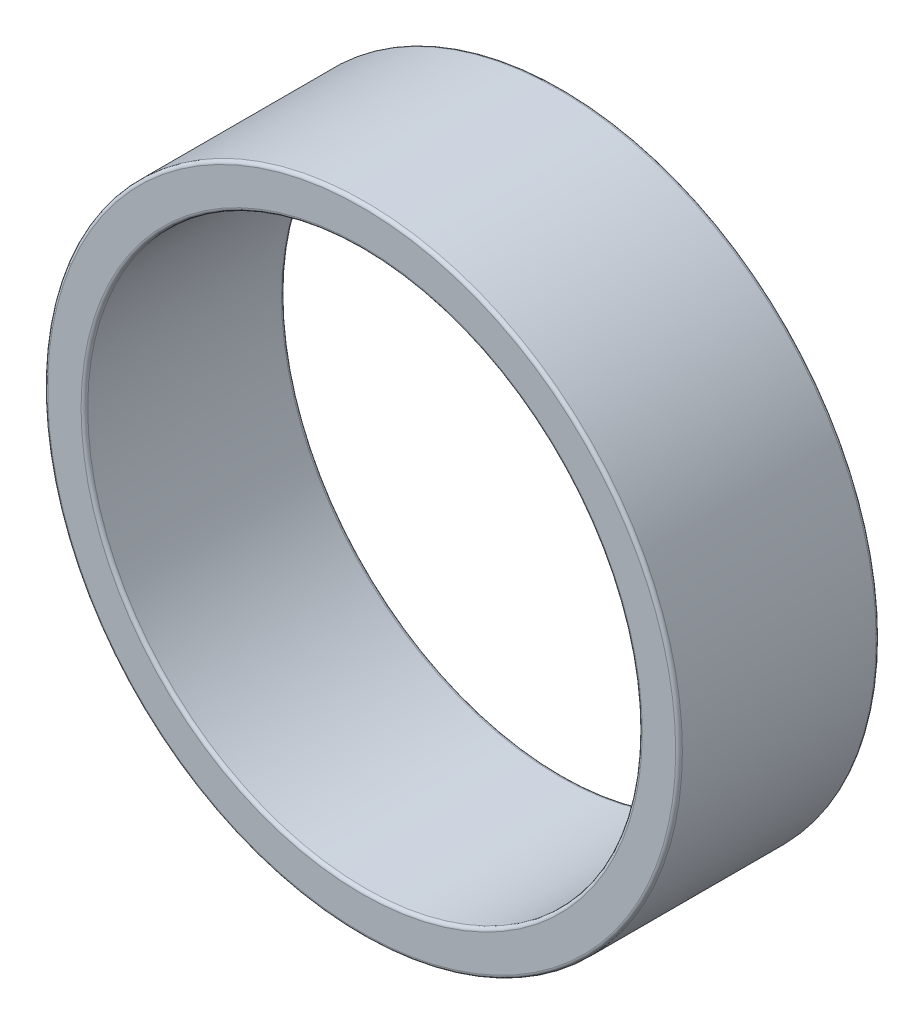
ISO-10303-21;
HEADER;
FILE_DESCRIPTION(('STEP AP214'),'2;1');
FILE_NAME('part.step','',(''),(''),'','','');
FILE_SCHEMA(('AUTOMOTIVE_DESIGN { 1 0 10303 214 1 1 1 1 }'));
ENDSEC;
DATA;
#1=APPLICATION_CONTEXT('core data for automotive mechanical design processes');
#2=APPLICATION_PROTOCOL_DEFINITION('international standard','automotive_design',2000,#1);
#3=PRODUCT_CONTEXT('',#1,'mechanical');
#4=PRODUCT('Part','Part','',(#3));
#5=PRODUCT_RELATED_PRODUCT_CATEGORY('part','',(#4));
#6=PRODUCT_DEFINITION_FORMATION('','',#4);
#7=PRODUCT_DEFINITION_CONTEXT('part definition',#1,'design');
#8=PRODUCT_DEFINITION('design','',#6,#7);
#9=PRODUCT_DEFINITION_SHAPE('','',#8);
#10=(LENGTH_UNIT() NAMED_UNIT(*) SI_UNIT(.MILLI.,.METRE.));
#11=(NAMED_UNIT(*) PLANE_ANGLE_UNIT() SI_UNIT($,.RADIAN.));
#12=(NAMED_UNIT(*) SI_UNIT($,.STERADIAN.) SOLID_ANGLE_UNIT());
#13=UNCERTAINTY_MEASURE_WITH_UNIT(LENGTH_MEASURE(1.E-05),#10,'distance_accuracy_value','');
#14=(GEOMETRIC_REPRESENTATION_CONTEXT(3) GLOBAL_UNCERTAINTY_ASSIGNED_CONTEXT((#13)) GLOBAL_UNIT_ASSIGNED_CONTEXT((#10,
#11,#12)) REPRESENTATION_CONTEXT('',''));
#15=CARTESIAN_POINT('',(0.,0.,0.));
#16=DIRECTION('',(0.,0.,1.));
#17=DIRECTION('',(1.,0.,0.));
#18=AXIS2_PLACEMENT_3D('',#15,#16,#17);
#19=CARTESIAN_POINT('',(0.,0.,6.));
#20=DIRECTION('',(0.,0.,1.));
#21=DIRECTION('',(1.,0.,0.));
#22=AXIS2_PLACEMENT_3D('',#19,#20,#21);
#23=PLANE('',#22);
#24=CARTESIAN_POINT('',(0.,0.,6.));
#25=DIRECTION('',(0.,0.,1.));
#26=DIRECTION('',(1.,0.,0.));
#27=AXIS2_PLACEMENT_3D('',#24,#25,#26);
#28=CIRCLE('',#27,8.4);
#29=CARTESIAN_POINT('',(8.4,0.,6.));
#30=VERTEX_POINT('',#29);
#31=EDGE_CURVE('E10',#30,#30,#28,.F.);
#32=ORIENTED_EDGE('',*,*,#31,.T.);
#33=EDGE_LOOP('',(#32));
#34=FACE_BOUND('',#33,.T.);
#35=CARTESIAN_POINT('',(0.,0.,6.));
#36=DIRECTION('',(0.,0.,1.));
#37=DIRECTION('',(1.,0.,0.));
#38=AXIS2_PLACEMENT_3D('',#35,#36,#37);
#39=CIRCLE('',#38,9.4);
#40=CARTESIAN_POINT('',(9.4,0.,6.));
#41=VERTEX_POINT('',#40);
#42=EDGE_CURVE('E38',#41,#41,#39,.T.);
#43=ORIENTED_EDGE('',*,*,#42,.T.);
#44=EDGE_LOOP('',(#43));
#45=FACE_BOUND('',#44,.T.);
#46=ADVANCED_FACE('F31',(#34,#45),#23,.T.);
#47=CARTESIAN_POINT('',(0.,0.,0.));
#48=DIRECTION('',(0.,0.,1.));
#49=DIRECTION('',(1.,0.,0.));
#50=AXIS2_PLACEMENT_3D('',#47,#48,#49);
#51=PLANE('',#50);
#52=CARTESIAN_POINT('',(0.,0.,0.));
#53=DIRECTION('',(0.,0.,1.));
#54=DIRECTION('',(1.,0.,0.));
#55=AXIS2_PLACEMENT_3D('',#52,#53,#54);
#56=CIRCLE('',#55,9.4);
#57=CARTESIAN_POINT('',(9.4,0.,0.));
#58=VERTEX_POINT('',#57);
#59=EDGE_CURVE('E51',#58,#58,#56,.F.);
#60=ORIENTED_EDGE('',*,*,#59,.T.);
#61=EDGE_LOOP('',(#60));
#62=FACE_BOUND('',#61,.T.);
#63=CARTESIAN_POINT('',(0.,0.,0.));
#64=DIRECTION('',(0.,0.,1.));
#65=DIRECTION('',(1.,0.,0.));
#66=AXIS2_PLACEMENT_3D('',#63,#64,#65);
#67=CIRCLE('',#66,8.4);
#68=CARTESIAN_POINT('',(8.4,0.,0.));
#69=VERTEX_POINT('',#68);
#70=EDGE_CURVE('E54',#69,#69,#67,.T.);
#71=ORIENTED_EDGE('',*,*,#70,.T.);
#72=EDGE_LOOP('',(#71));
#73=FACE_BOUND('',#72,.T.);
#74=ADVANCED_FACE('F75',(#62,#73),#51,.F.);
#75=CARTESIAN_POINT('',(0.,0.,6.));
#76=DIRECTION('',(0.,0.,-1.));
#77=DIRECTION('',(-1.,0.,0.));
#78=AXIS2_PLACEMENT_3D('',#75,#76,#77);
#79=CYLINDRICAL_SURFACE('',#78,9.5);
#80=CARTESIAN_POINT('',(0.,0.,0.1));
#81=DIRECTION('',(0.,0.,1.));
#82=DIRECTION('',(1.,0.,0.));
#83=AXIS2_PLACEMENT_3D('',#80,#81,#82);
#84=CIRCLE('',#83,9.5);
#85=CARTESIAN_POINT('',(9.5,0.,0.1));
#86=VERTEX_POINT('',#85);
#87=EDGE_CURVE('E57',#86,#86,#84,.T.);
#88=ORIENTED_EDGE('',*,*,#87,.T.);
#89=EDGE_LOOP('',(#88));
#90=FACE_BOUND('',#89,.T.);
#91=CARTESIAN_POINT('',(0.,0.,5.9));
#92=DIRECTION('',(0.,0.,1.));
#93=DIRECTION('',(1.,0.,0.));
#94=AXIS2_PLACEMENT_3D('',#91,#92,#93);
#95=CIRCLE('',#94,9.5);
#96=CARTESIAN_POINT('',(9.5,0.,5.9));
#97=VERTEX_POINT('',#96);
#98=EDGE_CURVE('E60',#97,#97,#95,.F.);
#99=ORIENTED_EDGE('',*,*,#98,.T.);
#100=EDGE_LOOP('',(#99));
#101=FACE_BOUND('',#100,.T.);
#102=ADVANCED_FACE('F64',(#90,#101),#79,.T.);
#103=CARTESIAN_POINT('',(0.,0.,6.));
#104=DIRECTION('',(0.,0.,-1.));
#105=DIRECTION('',(-1.,0.,0.));
#106=AXIS2_PLACEMENT_3D('',#103,#104,#105);
#107=CYLINDRICAL_SURFACE('',#106,8.3);
#108=CARTESIAN_POINT('',(0.,0.,0.1));
#109=DIRECTION('',(0.,0.,1.));
#110=DIRECTION('',(1.,0.,0.));
#111=AXIS2_PLACEMENT_3D('',#108,#109,#110);
#112=CIRCLE('',#111,8.3);
#113=CARTESIAN_POINT('',(8.3,0.,0.1));
#114=VERTEX_POINT('',#113);
#115=EDGE_CURVE('E42',#114,#114,#112,.F.);
#116=ORIENTED_EDGE('',*,*,#115,.T.);
#117=EDGE_LOOP('',(#116));
#118=FACE_BOUND('',#117,.T.);
#119=CARTESIAN_POINT('',(0.,0.,5.9));
#120=DIRECTION('',(0.,0.,1.));
#121=DIRECTION('',(1.,0.,0.));
#122=AXIS2_PLACEMENT_3D('',#119,#120,#121);
#123=CIRCLE('',#122,8.3);
#124=CARTESIAN_POINT('',(8.3,0.,5.9));
#125=VERTEX_POINT('',#124);
#126=EDGE_CURVE('E46',#125,#125,#123,.T.);
#127=ORIENTED_EDGE('',*,*,#126,.T.);
#128=EDGE_LOOP('',(#127));
#129=FACE_BOUND('',#128,.T.);
#130=ADVANCED_FACE('F83',(#118,#129),#107,.F.);
#131=CARTESIAN_POINT('',(0.,0.,0.1));
#132=DIRECTION('',(0.,0.,1.));
#133=DIRECTION('',(1.,0.,0.));
#134=AXIS2_PLACEMENT_3D('',#131,#132,#133);
#135=TOROIDAL_SURFACE('',#134,9.4,0.1);
#136=ORIENTED_EDGE('',*,*,#59,.F.);
#137=EDGE_LOOP('',(#136));
#138=FACE_BOUND('',#137,.T.);
#139=ORIENTED_EDGE('',*,*,#87,.F.);
#140=EDGE_LOOP('',(#139));
#141=FACE_BOUND('',#140,.T.);
#142=ADVANCED_FACE('F88',(#138,#141),#135,.T.);
#143=CARTESIAN_POINT('',(0.,0.,0.1));
#144=DIRECTION('',(0.,0.,1.));
#145=DIRECTION('',(1.,0.,0.));
#146=AXIS2_PLACEMENT_3D('',#143,#144,#145);
#147=TOROIDAL_SURFACE('',#146,8.4,0.1);
#148=ORIENTED_EDGE('',*,*,#115,.F.);
#149=EDGE_LOOP('',(#148));
#150=FACE_BOUND('',#149,.T.);
#151=ORIENTED_EDGE('',*,*,#70,.F.);
#152=EDGE_LOOP('',(#151));
#153=FACE_BOUND('',#152,.T.);
#154=ADVANCED_FACE('F72',(#150,#153),#147,.T.);
#155=CARTESIAN_POINT('',(0.,0.,5.9));
#156=DIRECTION('',(0.,0.,1.));
#157=DIRECTION('',(1.,0.,0.));
#158=AXIS2_PLACEMENT_3D('',#155,#156,#157);
#159=TOROIDAL_SURFACE('',#158,8.4,0.1);
#160=ORIENTED_EDGE('',*,*,#31,.F.);
#161=EDGE_LOOP('',(#160));
#162=FACE_BOUND('',#161,.T.);
#163=ORIENTED_EDGE('',*,*,#126,.F.);
#164=EDGE_LOOP('',(#163));
#165=FACE_BOUND('',#164,.T.);
#166=ADVANCED_FACE('F68',(#162,#165),#159,.T.);
#167=CARTESIAN_POINT('',(0.,0.,5.9));
#168=DIRECTION('',(0.,0.,1.));
#169=DIRECTION('',(1.,0.,0.));
#170=AXIS2_PLACEMENT_3D('',#167,#168,#169);
#171=TOROIDAL_SURFACE('',#170,9.4,0.1);
#172=ORIENTED_EDGE('',*,*,#98,.F.);
#173=EDGE_LOOP('',(#172));
#174=FACE_BOUND('',#173,.T.);
#175=ORIENTED_EDGE('',*,*,#42,.F.);
#176=EDGE_LOOP('',(#175));
#177=FACE_BOUND('',#176,.T.);
#178=ADVANCED_FACE('F33',(#174,#177),#171,.T.);
#179=CLOSED_SHELL('',(#46,#74,#102,#130,#142,#154,#166,#178));
#180=MANIFOLD_SOLID_BREP('B2',#179);
#181=ADVANCED_BREP_SHAPE_REPRESENTATION('',(#18,#180),#14);
#182=SHAPE_DEFINITION_REPRESENTATION(#9,#181);
ENDSEC;
END-ISO-10303-21;
